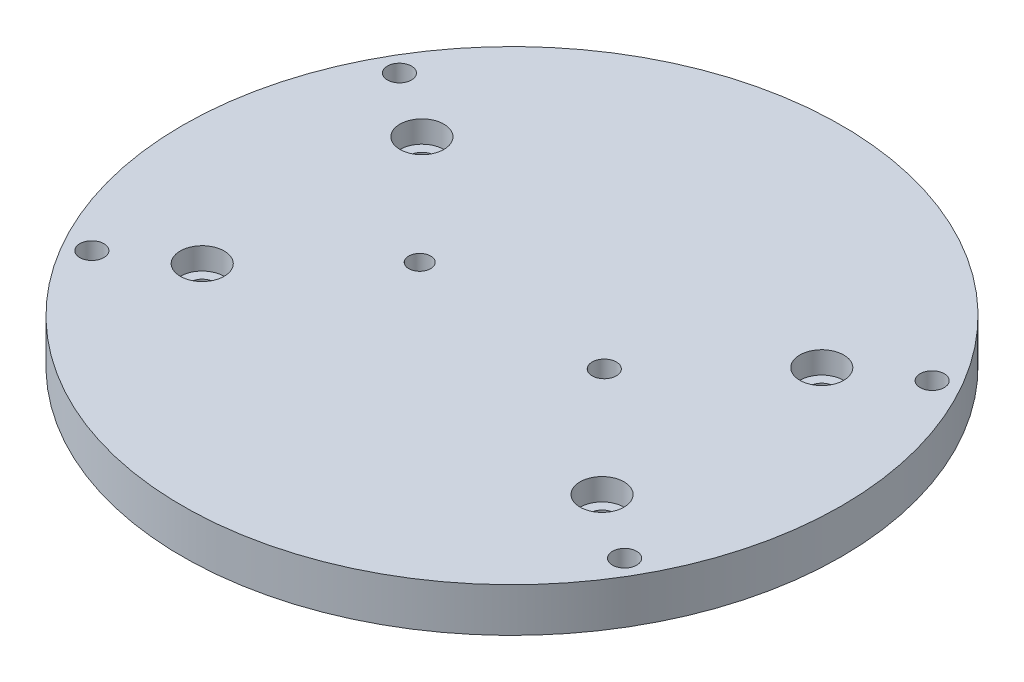
ISO-10303-21;
HEADER;
FILE_DESCRIPTION(('STEP AP214'),'2;1');
FILE_NAME('part.step','',(''),(''),'','','');
FILE_SCHEMA(('AUTOMOTIVE_DESIGN { 1 0 10303 214 1 1 1 1 }'));
ENDSEC;
DATA;
#1=APPLICATION_CONTEXT('core data for automotive mechanical design processes');
#2=APPLICATION_PROTOCOL_DEFINITION('international standard','automotive_design',2000,#1);
#3=PRODUCT_CONTEXT('',#1,'mechanical');
#4=PRODUCT('Part','Part','',(#3));
#5=PRODUCT_RELATED_PRODUCT_CATEGORY('part','',(#4));
#6=PRODUCT_DEFINITION_FORMATION('','',#4);
#7=PRODUCT_DEFINITION_CONTEXT('part definition',#1,'design');
#8=PRODUCT_DEFINITION('design','',#6,#7);
#9=PRODUCT_DEFINITION_SHAPE('','',#8);
#10=(LENGTH_UNIT() NAMED_UNIT(*) SI_UNIT(.MILLI.,.METRE.));
#11=(NAMED_UNIT(*) PLANE_ANGLE_UNIT() SI_UNIT($,.RADIAN.));
#12=(NAMED_UNIT(*) SI_UNIT($,.STERADIAN.) SOLID_ANGLE_UNIT());
#13=UNCERTAINTY_MEASURE_WITH_UNIT(LENGTH_MEASURE(1.E-05),#10,'distance_accuracy_value','');
#14=(GEOMETRIC_REPRESENTATION_CONTEXT(3) GLOBAL_UNCERTAINTY_ASSIGNED_CONTEXT((#13)) GLOBAL_UNIT_ASSIGNED_CONTEXT((#10,
#11,#12)) REPRESENTATION_CONTEXT('',''));
#15=CARTESIAN_POINT('',(0.,0.,0.));
#16=DIRECTION('',(0.,0.,1.));
#17=DIRECTION('',(1.,0.,0.));
#18=AXIS2_PLACEMENT_3D('',#15,#16,#17);
#19=CARTESIAN_POINT('',(45.5,330.,75.));
#20=DIRECTION('',(0.,-1.,0.));
#21=DIRECTION('',(1.,0.,0.));
#22=AXIS2_PLACEMENT_3D('',#19,#20,#21);
#23=CYLINDRICAL_SURFACE('',#22,2.75);
#24=CARTESIAN_POINT('',(45.5,320.,75.));
#25=DIRECTION('',(0.,-1.,0.));
#26=DIRECTION('',(1.,0.,0.));
#27=AXIS2_PLACEMENT_3D('',#24,#25,#26);
#28=CIRCLE('',#27,2.75);
#29=CARTESIAN_POINT('',(48.25,320.,75.));
#30=VERTEX_POINT('',#29);
#31=EDGE_CURVE('E467',#30,#30,#28,.T.);
#32=ORIENTED_EDGE('',*,*,#31,.T.);
#33=EDGE_LOOP('',(#32));
#34=FACE_BOUND('',#33,.T.);
#35=CARTESIAN_POINT('',(45.5,325.,75.));
#36=DIRECTION('',(0.,1.,0.));
#37=DIRECTION('',(-1.,0.,0.));
#38=AXIS2_PLACEMENT_3D('',#35,#36,#37);
#39=CIRCLE('',#38,2.75);
#40=CARTESIAN_POINT('',(42.75,325.,75.));
#41=VERTEX_POINT('',#40);
#42=EDGE_CURVE('E402',#41,#41,#39,.F.);
#43=ORIENTED_EDGE('',*,*,#42,.F.);
#44=EDGE_LOOP('',(#43));
#45=FACE_BOUND('',#44,.T.);
#46=ADVANCED_FACE('F398',(#34,#45),#23,.F.);
#47=CARTESIAN_POINT('',(-45.5000000000001,330.,25.));
#48=DIRECTION('',(0.,-1.,0.));
#49=DIRECTION('',(1.,0.,0.));
#50=AXIS2_PLACEMENT_3D('',#47,#48,#49);
#51=CYLINDRICAL_SURFACE('',#50,2.75);
#52=CARTESIAN_POINT('',(-45.5000000000001,320.,25.));
#53=DIRECTION('',(0.,-1.,0.));
#54=DIRECTION('',(-1.,0.,0.));
#55=AXIS2_PLACEMENT_3D('',#52,#53,#54);
#56=CIRCLE('',#55,2.75);
#57=CARTESIAN_POINT('',(-48.2500000000001,320.,25.));
#58=VERTEX_POINT('',#57);
#59=EDGE_CURVE('E470',#58,#58,#56,.T.);
#60=ORIENTED_EDGE('',*,*,#59,.T.);
#61=EDGE_LOOP('',(#60));
#62=FACE_BOUND('',#61,.T.);
#63=CARTESIAN_POINT('',(-45.5000000000001,325.,25.));
#64=DIRECTION('',(0.,1.,0.));
#65=DIRECTION('',(-1.,0.,0.));
#66=AXIS2_PLACEMENT_3D('',#63,#64,#65);
#67=CIRCLE('',#66,2.75);
#68=CARTESIAN_POINT('',(-48.2500000000001,325.,25.));
#69=VERTEX_POINT('',#68);
#70=EDGE_CURVE('E421',#69,#69,#67,.F.);
#71=ORIENTED_EDGE('',*,*,#70,.F.);
#72=EDGE_LOOP('',(#71));
#73=FACE_BOUND('',#72,.T.);
#74=ADVANCED_FACE('F498',(#62,#73),#51,.F.);
#75=CARTESIAN_POINT('',(45.5,330.,25.));
#76=DIRECTION('',(0.,-1.,0.));
#77=DIRECTION('',(1.,0.,0.));
#78=AXIS2_PLACEMENT_3D('',#75,#76,#77);
#79=CYLINDRICAL_SURFACE('',#78,2.75);
#80=CARTESIAN_POINT('',(45.5,320.,25.));
#81=DIRECTION('',(0.,-1.,0.));
#82=DIRECTION('',(1.,0.,0.));
#83=AXIS2_PLACEMENT_3D('',#80,#81,#82);
#84=CIRCLE('',#83,2.75);
#85=CARTESIAN_POINT('',(48.25,320.,25.));
#86=VERTEX_POINT('',#85);
#87=EDGE_CURVE('E442',#86,#86,#84,.T.);
#88=ORIENTED_EDGE('',*,*,#87,.T.);
#89=EDGE_LOOP('',(#88));
#90=FACE_BOUND('',#89,.T.);
#91=CARTESIAN_POINT('',(45.5,325.,25.));
#92=DIRECTION('',(0.,1.,0.));
#93=DIRECTION('',(-1.,0.,0.));
#94=AXIS2_PLACEMENT_3D('',#91,#92,#93);
#95=CIRCLE('',#94,2.75);
#96=CARTESIAN_POINT('',(42.75,325.,25.));
#97=VERTEX_POINT('',#96);
#98=EDGE_CURVE('E418',#97,#97,#95,.F.);
#99=ORIENTED_EDGE('',*,*,#98,.F.);
#100=EDGE_LOOP('',(#99));
#101=FACE_BOUND('',#100,.T.);
#102=ADVANCED_FACE('F504',(#90,#101),#79,.F.);
#103=CARTESIAN_POINT('',(-45.5000000000001,330.,75.));
#104=DIRECTION('',(0.,-1.,0.));
#105=DIRECTION('',(1.,0.,0.));
#106=AXIS2_PLACEMENT_3D('',#103,#104,#105);
#107=CYLINDRICAL_SURFACE('',#106,2.75);
#108=CARTESIAN_POINT('',(-45.5000000000001,320.,75.));
#109=DIRECTION('',(0.,-1.,0.));
#110=DIRECTION('',(-1.,0.,0.));
#111=AXIS2_PLACEMENT_3D('',#108,#109,#110);
#112=CIRCLE('',#111,2.75);
#113=CARTESIAN_POINT('',(-48.2500000000001,320.,75.));
#114=VERTEX_POINT('',#113);
#115=EDGE_CURVE('E439',#114,#114,#112,.T.);
#116=ORIENTED_EDGE('',*,*,#115,.T.);
#117=EDGE_LOOP('',(#116));
#118=FACE_BOUND('',#117,.T.);
#119=CARTESIAN_POINT('',(-45.5000000000001,325.,75.));
#120=DIRECTION('',(0.,1.,0.));
#121=DIRECTION('',(-1.,0.,0.));
#122=AXIS2_PLACEMENT_3D('',#119,#120,#121);
#123=CIRCLE('',#122,2.75);
#124=CARTESIAN_POINT('',(-48.2500000000001,325.,75.));
#125=VERTEX_POINT('',#124);
#126=EDGE_CURVE('E415',#125,#125,#123,.F.);
#127=ORIENTED_EDGE('',*,*,#126,.F.);
#128=EDGE_LOOP('',(#127));
#129=FACE_BOUND('',#128,.T.);
#130=ADVANCED_FACE('F485',(#118,#129),#107,.F.);
#131=CARTESIAN_POINT('',(0.,320.,50.));
#132=DIRECTION('',(0.,1.,0.));
#133=DIRECTION('',(-1.,0.,0.));
#134=AXIS2_PLACEMENT_3D('',#131,#132,#133);
#135=PLANE('',#134);
#136=CARTESIAN_POINT('',(-60.6217782649106,320.,14.9999999999998));
#137=DIRECTION('',(0.,-1.,0.));
#138=DIRECTION('',(1.,0.,0.));
#139=AXIS2_PLACEMENT_3D('',#136,#137,#138);
#140=CIRCLE('',#139,2.75);
#141=CARTESIAN_POINT('',(-57.8717782649106,320.,14.9999999999998));
#142=VERTEX_POINT('',#141);
#143=EDGE_CURVE('E435',#142,#142,#140,.T.);
#144=ORIENTED_EDGE('',*,*,#143,.F.);
#145=EDGE_LOOP('',(#144));
#146=FACE_BOUND('',#145,.T.);
#147=CARTESIAN_POINT('',(60.6217782649107,320.,14.9999999999999));
#148=DIRECTION('',(0.,-1.,0.));
#149=DIRECTION('',(-1.,0.,0.));
#150=AXIS2_PLACEMENT_3D('',#147,#148,#149);
#151=CIRCLE('',#150,2.75000000000001);
#152=CARTESIAN_POINT('',(57.8717782649106,320.,14.9999999999999));
#153=VERTEX_POINT('',#152);
#154=EDGE_CURVE('E452',#153,#153,#151,.T.);
#155=ORIENTED_EDGE('',*,*,#154,.F.);
#156=EDGE_LOOP('',(#155));
#157=FACE_BOUND('',#156,.T.);
#158=CARTESIAN_POINT('',(60.6217782649107,320.,85.0000000000001));
#159=DIRECTION('',(0.,-1.,0.));
#160=DIRECTION('',(1.,0.,0.));
#161=AXIS2_PLACEMENT_3D('',#158,#159,#160);
#162=CIRCLE('',#161,2.75000000000001);
#163=CARTESIAN_POINT('',(63.3717782649107,320.,85.0000000000001));
#164=VERTEX_POINT('',#163);
#165=EDGE_CURVE('E446',#164,#164,#162,.T.);
#166=ORIENTED_EDGE('',*,*,#165,.F.);
#167=EDGE_LOOP('',(#166));
#168=FACE_BOUND('',#167,.T.);
#169=ORIENTED_EDGE('',*,*,#115,.F.);
#170=EDGE_LOOP('',(#169));
#171=FACE_BOUND('',#170,.T.);
#172=ORIENTED_EDGE('',*,*,#87,.F.);
#173=EDGE_LOOP('',(#172));
#174=FACE_BOUND('',#173,.T.);
#175=ORIENTED_EDGE('',*,*,#59,.F.);
#176=EDGE_LOOP('',(#175));
#177=FACE_BOUND('',#176,.T.);
#178=ORIENTED_EDGE('',*,*,#31,.F.);
#179=EDGE_LOOP('',(#178));
#180=FACE_BOUND('',#179,.T.);
#181=CARTESIAN_POINT('',(-21.,320.,50.));
#182=DIRECTION('',(0.,-1.,0.));
#183=DIRECTION('',(1.,0.,0.));
#184=AXIS2_PLACEMENT_3D('',#181,#182,#183);
#185=CIRCLE('',#184,2.5);
#186=CARTESIAN_POINT('',(-18.5,320.,50.));
#187=VERTEX_POINT('',#186);
#188=EDGE_CURVE('E464',#187,#187,#185,.T.);
#189=ORIENTED_EDGE('',*,*,#188,.F.);
#190=EDGE_LOOP('',(#189));
#191=FACE_BOUND('',#190,.T.);
#192=CARTESIAN_POINT('',(-60.6217782649107,320.,85.));
#193=DIRECTION('',(0.,-1.,0.));
#194=DIRECTION('',(-1.,0.,0.));
#195=AXIS2_PLACEMENT_3D('',#192,#193,#194);
#196=CIRCLE('',#195,2.75);
#197=CARTESIAN_POINT('',(-63.3717782649107,320.,85.));
#198=VERTEX_POINT('',#197);
#199=EDGE_CURVE('E426',#198,#198,#196,.T.);
#200=ORIENTED_EDGE('',*,*,#199,.F.);
#201=EDGE_LOOP('',(#200));
#202=FACE_BOUND('',#201,.T.);
#203=CARTESIAN_POINT('',(21.,320.,50.));
#204=DIRECTION('',(0.,-1.,0.));
#205=DIRECTION('',(1.,0.,0.));
#206=AXIS2_PLACEMENT_3D('',#203,#204,#205);
#207=CIRCLE('',#206,2.75);
#208=CARTESIAN_POINT('',(23.75,320.,50.));
#209=VERTEX_POINT('',#208);
#210=EDGE_CURVE('E463',#209,#209,#207,.T.);
#211=ORIENTED_EDGE('',*,*,#210,.F.);
#212=EDGE_LOOP('',(#211));
#213=FACE_BOUND('',#212,.T.);
#214=CARTESIAN_POINT('',(0.,320.,50.));
#215=DIRECTION('',(0.,1.,0.));
#216=DIRECTION('',(-1.,0.,0.));
#217=AXIS2_PLACEMENT_3D('',#214,#215,#216);
#218=CIRCLE('',#217,75.);
#219=CARTESIAN_POINT('',(-75.,320.,50.));
#220=VERTEX_POINT('',#219);
#221=EDGE_CURVE('E406',#220,#220,#218,.T.);
#222=ORIENTED_EDGE('',*,*,#221,.F.);
#223=EDGE_LOOP('',(#222));
#224=FACE_BOUND('',#223,.T.);
#225=ADVANCED_FACE('F481',(#146,#157,#168,#171,#174,#177,#180,#191,#202,#213,#224),#135,.F.);
#226=CARTESIAN_POINT('',(0.,330.,50.));
#227=DIRECTION('',(0.,-1.,0.));
#228=DIRECTION('',(1.,0.,0.));
#229=AXIS2_PLACEMENT_3D('',#226,#227,#228);
#230=CYLINDRICAL_SURFACE('',#229,75.);
#231=CARTESIAN_POINT('',(0.,330.,50.));
#232=DIRECTION('',(0.,1.,0.));
#233=DIRECTION('',(-1.,0.,0.));
#234=AXIS2_PLACEMENT_3D('',#231,#232,#233);
#235=CIRCLE('',#234,75.);
#236=CARTESIAN_POINT('',(-75.,330.,50.));
#237=VERTEX_POINT('',#236);
#238=EDGE_CURVE('E11',#237,#237,#235,.T.);
#239=ORIENTED_EDGE('',*,*,#238,.F.);
#240=EDGE_LOOP('',(#239));
#241=FACE_BOUND('',#240,.T.);
#242=ORIENTED_EDGE('',*,*,#221,.T.);
#243=EDGE_LOOP('',(#242));
#244=FACE_BOUND('',#243,.T.);
#245=ADVANCED_FACE('F484',(#241,#244),#230,.T.);
#246=CARTESIAN_POINT('',(0.,330.,50.));
#247=DIRECTION('',(0.,1.,0.));
#248=DIRECTION('',(-1.,0.,0.));
#249=AXIS2_PLACEMENT_3D('',#246,#247,#248);
#250=PLANE('',#249);
#251=CARTESIAN_POINT('',(-45.5000000000001,330.,25.));
#252=DIRECTION('',(0.,1.,0.));
#253=DIRECTION('',(-1.,0.,0.));
#254=AXIS2_PLACEMENT_3D('',#251,#252,#253);
#255=CIRCLE('',#254,5.);
#256=CARTESIAN_POINT('',(-50.5000000000001,330.,25.));
#257=VERTEX_POINT('',#256);
#258=EDGE_CURVE('E624',#257,#257,#255,.T.);
#259=ORIENTED_EDGE('',*,*,#258,.F.);
#260=EDGE_LOOP('',(#259));
#261=FACE_BOUND('',#260,.T.);
#262=CARTESIAN_POINT('',(-45.5000000000001,330.,75.));
#263=DIRECTION('',(0.,1.,0.));
#264=DIRECTION('',(-1.,0.,0.));
#265=AXIS2_PLACEMENT_3D('',#262,#263,#264);
#266=CIRCLE('',#265,5.);
#267=CARTESIAN_POINT('',(-50.5000000000001,330.,75.));
#268=VERTEX_POINT('',#267);
#269=EDGE_CURVE('E618',#268,#268,#266,.T.);
#270=ORIENTED_EDGE('',*,*,#269,.F.);
#271=EDGE_LOOP('',(#270));
#272=FACE_BOUND('',#271,.T.);
#273=CARTESIAN_POINT('',(45.5,330.,75.));
#274=DIRECTION('',(0.,1.,0.));
#275=DIRECTION('',(-1.,0.,0.));
#276=AXIS2_PLACEMENT_3D('',#273,#274,#275);
#277=CIRCLE('',#276,5.);
#278=CARTESIAN_POINT('',(40.5,330.,75.));
#279=VERTEX_POINT('',#278);
#280=EDGE_CURVE('E609',#279,#279,#277,.T.);
#281=ORIENTED_EDGE('',*,*,#280,.F.);
#282=EDGE_LOOP('',(#281));
#283=FACE_BOUND('',#282,.T.);
#284=CARTESIAN_POINT('',(45.5,330.,25.));
#285=DIRECTION('',(0.,1.,0.));
#286=DIRECTION('',(-1.,0.,0.));
#287=AXIS2_PLACEMENT_3D('',#284,#285,#286);
#288=CIRCLE('',#287,5.);
#289=CARTESIAN_POINT('',(40.5,330.,25.));
#290=VERTEX_POINT('',#289);
#291=EDGE_CURVE('E608',#290,#290,#288,.T.);
#292=ORIENTED_EDGE('',*,*,#291,.F.);
#293=EDGE_LOOP('',(#292));
#294=FACE_BOUND('',#293,.T.);
#295=CARTESIAN_POINT('',(-60.6217782649106,330.,14.9999999999998));
#296=DIRECTION('',(0.,-1.,0.));
#297=DIRECTION('',(1.,0.,0.));
#298=AXIS2_PLACEMENT_3D('',#295,#296,#297);
#299=CIRCLE('',#298,2.75);
#300=CARTESIAN_POINT('',(-57.8717782649106,330.,14.9999999999998));
#301=VERTEX_POINT('',#300);
#302=EDGE_CURVE('E455',#301,#301,#299,.T.);
#303=ORIENTED_EDGE('',*,*,#302,.T.);
#304=EDGE_LOOP('',(#303));
#305=FACE_BOUND('',#304,.T.);
#306=CARTESIAN_POINT('',(60.6217782649107,330.,14.9999999999999));
#307=DIRECTION('',(0.,-1.,0.));
#308=DIRECTION('',(-1.,0.,0.));
#309=AXIS2_PLACEMENT_3D('',#306,#307,#308);
#310=CIRCLE('',#309,2.75000000000001);
#311=CARTESIAN_POINT('',(57.8717782649106,330.,14.9999999999999));
#312=VERTEX_POINT('',#311);
#313=EDGE_CURVE('E449',#312,#312,#310,.T.);
#314=ORIENTED_EDGE('',*,*,#313,.T.);
#315=EDGE_LOOP('',(#314));
#316=FACE_BOUND('',#315,.T.);
#317=CARTESIAN_POINT('',(60.6217782649107,330.,85.0000000000001));
#318=DIRECTION('',(0.,-1.,0.));
#319=DIRECTION('',(1.,0.,0.));
#320=AXIS2_PLACEMENT_3D('',#317,#318,#319);
#321=CIRCLE('',#320,2.75000000000001);
#322=CARTESIAN_POINT('',(63.3717782649107,330.,85.0000000000001));
#323=VERTEX_POINT('',#322);
#324=EDGE_CURVE('E443',#323,#323,#321,.T.);
#325=ORIENTED_EDGE('',*,*,#324,.T.);
#326=EDGE_LOOP('',(#325));
#327=FACE_BOUND('',#326,.T.);
#328=CARTESIAN_POINT('',(-21.,330.,50.));
#329=DIRECTION('',(0.,-1.,0.));
#330=DIRECTION('',(1.,0.,0.));
#331=AXIS2_PLACEMENT_3D('',#328,#329,#330);
#332=CIRCLE('',#331,2.5);
#333=CARTESIAN_POINT('',(-18.5,330.,50.));
#334=VERTEX_POINT('',#333);
#335=EDGE_CURVE('E460',#334,#334,#332,.T.);
#336=ORIENTED_EDGE('',*,*,#335,.T.);
#337=EDGE_LOOP('',(#336));
#338=FACE_BOUND('',#337,.T.);
#339=CARTESIAN_POINT('',(-60.6217782649107,330.,85.));
#340=DIRECTION('',(0.,-1.,0.));
#341=DIRECTION('',(-1.,0.,0.));
#342=AXIS2_PLACEMENT_3D('',#339,#340,#341);
#343=CIRCLE('',#342,2.75);
#344=CARTESIAN_POINT('',(-63.3717782649107,330.,85.));
#345=VERTEX_POINT('',#344);
#346=EDGE_CURVE('E430',#345,#345,#343,.T.);
#347=ORIENTED_EDGE('',*,*,#346,.T.);
#348=EDGE_LOOP('',(#347));
#349=FACE_BOUND('',#348,.T.);
#350=CARTESIAN_POINT('',(21.,330.,50.));
#351=DIRECTION('',(0.,-1.,0.));
#352=DIRECTION('',(1.,0.,0.));
#353=AXIS2_PLACEMENT_3D('',#350,#351,#352);
#354=CIRCLE('',#353,2.75);
#355=CARTESIAN_POINT('',(23.75,330.,50.));
#356=VERTEX_POINT('',#355);
#357=EDGE_CURVE('E411',#356,#356,#354,.T.);
#358=ORIENTED_EDGE('',*,*,#357,.T.);
#359=EDGE_LOOP('',(#358));
#360=FACE_BOUND('',#359,.T.);
#361=ORIENTED_EDGE('',*,*,#238,.T.);
#362=EDGE_LOOP('',(#361));
#363=FACE_BOUND('',#362,.T.);
#364=ADVANCED_FACE('F400',(#261,#272,#283,#294,#305,#316,#327,#338,#349,#360,#363),#250,.T.);
#365=CARTESIAN_POINT('',(21.,330.,50.));
#366=DIRECTION('',(0.,-1.,0.));
#367=DIRECTION('',(1.,0.,0.));
#368=AXIS2_PLACEMENT_3D('',#365,#366,#367);
#369=CYLINDRICAL_SURFACE('',#368,2.75);
#370=ORIENTED_EDGE('',*,*,#357,.F.);
#371=EDGE_LOOP('',(#370));
#372=FACE_BOUND('',#371,.T.);
#373=ORIENTED_EDGE('',*,*,#210,.T.);
#374=EDGE_LOOP('',(#373));
#375=FACE_BOUND('',#374,.T.);
#376=ADVANCED_FACE('F479',(#372,#375),#369,.F.);
#377=CARTESIAN_POINT('',(-60.6217782649107,330.,85.));
#378=DIRECTION('',(0.,-1.,0.));
#379=DIRECTION('',(1.,0.,0.));
#380=AXIS2_PLACEMENT_3D('',#377,#378,#379);
#381=CYLINDRICAL_SURFACE('',#380,2.75);
#382=ORIENTED_EDGE('',*,*,#346,.F.);
#383=EDGE_LOOP('',(#382));
#384=FACE_BOUND('',#383,.T.);
#385=ORIENTED_EDGE('',*,*,#199,.T.);
#386=EDGE_LOOP('',(#385));
#387=FACE_BOUND('',#386,.T.);
#388=ADVANCED_FACE('F515',(#384,#387),#381,.F.);
#389=CARTESIAN_POINT('',(-21.,330.,50.));
#390=DIRECTION('',(0.,-1.,0.));
#391=DIRECTION('',(1.,0.,0.));
#392=AXIS2_PLACEMENT_3D('',#389,#390,#391);
#393=CYLINDRICAL_SURFACE('',#392,2.5);
#394=ORIENTED_EDGE('',*,*,#335,.F.);
#395=EDGE_LOOP('',(#394));
#396=FACE_BOUND('',#395,.T.);
#397=ORIENTED_EDGE('',*,*,#188,.T.);
#398=EDGE_LOOP('',(#397));
#399=FACE_BOUND('',#398,.T.);
#400=ADVANCED_FACE('F509',(#396,#399),#393,.F.);
#401=CARTESIAN_POINT('',(60.6217782649107,330.,85.0000000000001));
#402=DIRECTION('',(0.,-1.,0.));
#403=DIRECTION('',(1.,0.,0.));
#404=AXIS2_PLACEMENT_3D('',#401,#402,#403);
#405=CYLINDRICAL_SURFACE('',#404,2.75000000000001);
#406=ORIENTED_EDGE('',*,*,#324,.F.);
#407=EDGE_LOOP('',(#406));
#408=FACE_BOUND('',#407,.T.);
#409=ORIENTED_EDGE('',*,*,#165,.T.);
#410=EDGE_LOOP('',(#409));
#411=FACE_BOUND('',#410,.T.);
#412=ADVANCED_FACE('F527',(#408,#411),#405,.F.);
#413=CARTESIAN_POINT('',(60.6217782649107,330.,14.9999999999999));
#414=DIRECTION('',(0.,-1.,0.));
#415=DIRECTION('',(1.,0.,0.));
#416=AXIS2_PLACEMENT_3D('',#413,#414,#415);
#417=CYLINDRICAL_SURFACE('',#416,2.75000000000001);
#418=ORIENTED_EDGE('',*,*,#313,.F.);
#419=EDGE_LOOP('',(#418));
#420=FACE_BOUND('',#419,.T.);
#421=ORIENTED_EDGE('',*,*,#154,.T.);
#422=EDGE_LOOP('',(#421));
#423=FACE_BOUND('',#422,.T.);
#424=ADVANCED_FACE('F539',(#420,#423),#417,.F.);
#425=CARTESIAN_POINT('',(-60.6217782649106,330.,14.9999999999998));
#426=DIRECTION('',(0.,-1.,0.));
#427=DIRECTION('',(1.,0.,0.));
#428=AXIS2_PLACEMENT_3D('',#425,#426,#427);
#429=CYLINDRICAL_SURFACE('',#428,2.75);
#430=ORIENTED_EDGE('',*,*,#302,.F.);
#431=EDGE_LOOP('',(#430));
#432=FACE_BOUND('',#431,.T.);
#433=ORIENTED_EDGE('',*,*,#143,.T.);
#434=EDGE_LOOP('',(#433));
#435=FACE_BOUND('',#434,.T.);
#436=ADVANCED_FACE('F542',(#432,#435),#429,.F.);
#437=CARTESIAN_POINT('',(-45.5000000000001,325.,75.));
#438=DIRECTION('',(0.,1.,0.));
#439=DIRECTION('',(-1.,0.,0.));
#440=AXIS2_PLACEMENT_3D('',#437,#438,#439);
#441=PLANE('',#440);
#442=CARTESIAN_POINT('',(-45.5000000000001,325.,75.));
#443=DIRECTION('',(0.,1.,0.));
#444=DIRECTION('',(-1.,0.,0.));
#445=AXIS2_PLACEMENT_3D('',#442,#443,#444);
#446=CIRCLE('',#445,5.);
#447=CARTESIAN_POINT('',(-50.5000000000001,325.,75.));
#448=VERTEX_POINT('',#447);
#449=EDGE_CURVE('E613',#448,#448,#446,.T.);
#450=ORIENTED_EDGE('',*,*,#449,.T.);
#451=EDGE_LOOP('',(#450));
#452=FACE_BOUND('',#451,.T.);
#453=ORIENTED_EDGE('',*,*,#126,.T.);
#454=EDGE_LOOP('',(#453));
#455=FACE_BOUND('',#454,.T.);
#456=ADVANCED_FACE('F545',(#452,#455),#441,.T.);
#457=CARTESIAN_POINT('',(-45.5000000000001,325.,75.));
#458=DIRECTION('',(0.,1.,0.));
#459=DIRECTION('',(-1.,0.,0.));
#460=AXIS2_PLACEMENT_3D('',#457,#458,#459);
#461=CYLINDRICAL_SURFACE('',#460,5.);
#462=ORIENTED_EDGE('',*,*,#449,.F.);
#463=EDGE_LOOP('',(#462));
#464=FACE_BOUND('',#463,.T.);
#465=ORIENTED_EDGE('',*,*,#269,.T.);
#466=EDGE_LOOP('',(#465));
#467=FACE_BOUND('',#466,.T.);
#468=ADVANCED_FACE('F550',(#464,#467),#461,.F.);
#469=CARTESIAN_POINT('',(45.5,325.,25.));
#470=DIRECTION('',(0.,1.,0.));
#471=DIRECTION('',(-1.,0.,0.));
#472=AXIS2_PLACEMENT_3D('',#469,#470,#471);
#473=PLANE('',#472);
#474=CARTESIAN_POINT('',(45.5,325.,25.));
#475=DIRECTION('',(0.,1.,0.));
#476=DIRECTION('',(-1.,0.,0.));
#477=AXIS2_PLACEMENT_3D('',#474,#475,#476);
#478=CIRCLE('',#477,5.);
#479=CARTESIAN_POINT('',(40.5,325.,25.));
#480=VERTEX_POINT('',#479);
#481=EDGE_CURVE('E419',#480,#480,#478,.T.);
#482=ORIENTED_EDGE('',*,*,#481,.T.);
#483=EDGE_LOOP('',(#482));
#484=FACE_BOUND('',#483,.T.);
#485=ORIENTED_EDGE('',*,*,#98,.T.);
#486=EDGE_LOOP('',(#485));
#487=FACE_BOUND('',#486,.T.);
#488=ADVANCED_FACE('F576',(#484,#487),#473,.T.);
#489=CARTESIAN_POINT('',(45.5,325.,25.));
#490=DIRECTION('',(0.,1.,0.));
#491=DIRECTION('',(-1.,0.,0.));
#492=AXIS2_PLACEMENT_3D('',#489,#490,#491);
#493=CYLINDRICAL_SURFACE('',#492,5.);
#494=ORIENTED_EDGE('',*,*,#481,.F.);
#495=EDGE_LOOP('',(#494));
#496=FACE_BOUND('',#495,.T.);
#497=ORIENTED_EDGE('',*,*,#291,.T.);
#498=EDGE_LOOP('',(#497));
#499=FACE_BOUND('',#498,.T.);
#500=ADVANCED_FACE('F532',(#496,#499),#493,.F.);
#501=CARTESIAN_POINT('',(-45.5000000000001,325.,25.));
#502=DIRECTION('',(0.,1.,0.));
#503=DIRECTION('',(-1.,0.,0.));
#504=AXIS2_PLACEMENT_3D('',#501,#502,#503);
#505=PLANE('',#504);
#506=CARTESIAN_POINT('',(-45.5000000000001,325.,25.));
#507=DIRECTION('',(0.,1.,0.));
#508=DIRECTION('',(-1.,0.,0.));
#509=AXIS2_PLACEMENT_3D('',#506,#507,#508);
#510=CIRCLE('',#509,5.);
#511=CARTESIAN_POINT('',(-50.5000000000001,325.,25.));
#512=VERTEX_POINT('',#511);
#513=EDGE_CURVE('E621',#512,#512,#510,.T.);
#514=ORIENTED_EDGE('',*,*,#513,.T.);
#515=EDGE_LOOP('',(#514));
#516=FACE_BOUND('',#515,.T.);
#517=ORIENTED_EDGE('',*,*,#70,.T.);
#518=EDGE_LOOP('',(#517));
#519=FACE_BOUND('',#518,.T.);
#520=ADVANCED_FACE('F583',(#516,#519),#505,.T.);
#521=CARTESIAN_POINT('',(-45.5000000000001,325.,25.));
#522=DIRECTION('',(0.,1.,0.));
#523=DIRECTION('',(-1.,0.,0.));
#524=AXIS2_PLACEMENT_3D('',#521,#522,#523);
#525=CYLINDRICAL_SURFACE('',#524,5.);
#526=ORIENTED_EDGE('',*,*,#513,.F.);
#527=EDGE_LOOP('',(#526));
#528=FACE_BOUND('',#527,.T.);
#529=ORIENTED_EDGE('',*,*,#258,.T.);
#530=EDGE_LOOP('',(#529));
#531=FACE_BOUND('',#530,.T.);
#532=ADVANCED_FACE('F589',(#528,#531),#525,.F.);
#533=CARTESIAN_POINT('',(45.5,325.,75.));
#534=DIRECTION('',(0.,1.,0.));
#535=DIRECTION('',(-1.,0.,0.));
#536=AXIS2_PLACEMENT_3D('',#533,#534,#535);
#537=PLANE('',#536);
#538=CARTESIAN_POINT('',(45.5,325.,75.));
#539=DIRECTION('',(0.,1.,0.));
#540=DIRECTION('',(-1.,0.,0.));
#541=AXIS2_PLACEMENT_3D('',#538,#539,#540);
#542=CIRCLE('',#541,5.);
#543=CARTESIAN_POINT('',(40.5,325.,75.));
#544=VERTEX_POINT('',#543);
#545=EDGE_CURVE('E607',#544,#544,#542,.T.);
#546=ORIENTED_EDGE('',*,*,#545,.T.);
#547=EDGE_LOOP('',(#546));
#548=FACE_BOUND('',#547,.T.);
#549=ORIENTED_EDGE('',*,*,#42,.T.);
#550=EDGE_LOOP('',(#549));
#551=FACE_BOUND('',#550,.T.);
#552=ADVANCED_FACE('F592',(#548,#551),#537,.T.);
#553=CARTESIAN_POINT('',(45.5,325.,75.));
#554=DIRECTION('',(0.,1.,0.));
#555=DIRECTION('',(-1.,0.,0.));
#556=AXIS2_PLACEMENT_3D('',#553,#554,#555);
#557=CYLINDRICAL_SURFACE('',#556,5.);
#558=ORIENTED_EDGE('',*,*,#545,.F.);
#559=EDGE_LOOP('',(#558));
#560=FACE_BOUND('',#559,.T.);
#561=ORIENTED_EDGE('',*,*,#280,.T.);
#562=EDGE_LOOP('',(#561));
#563=FACE_BOUND('',#562,.T.);
#564=ADVANCED_FACE('F597',(#560,#563),#557,.F.);
#565=CLOSED_SHELL('',(#46,#74,#102,#130,#225,#245,#364,#376,#388,#400,#412,#424,#436,#456,#468,
#488,#500,#520,#532,#552,#564));
#566=MANIFOLD_SOLID_BREP('B2',#565);
#567=ADVANCED_BREP_SHAPE_REPRESENTATION('',(#18,#566),#14);
#568=SHAPE_DEFINITION_REPRESENTATION(#9,#567);
ENDSEC;
END-ISO-10303-21;
